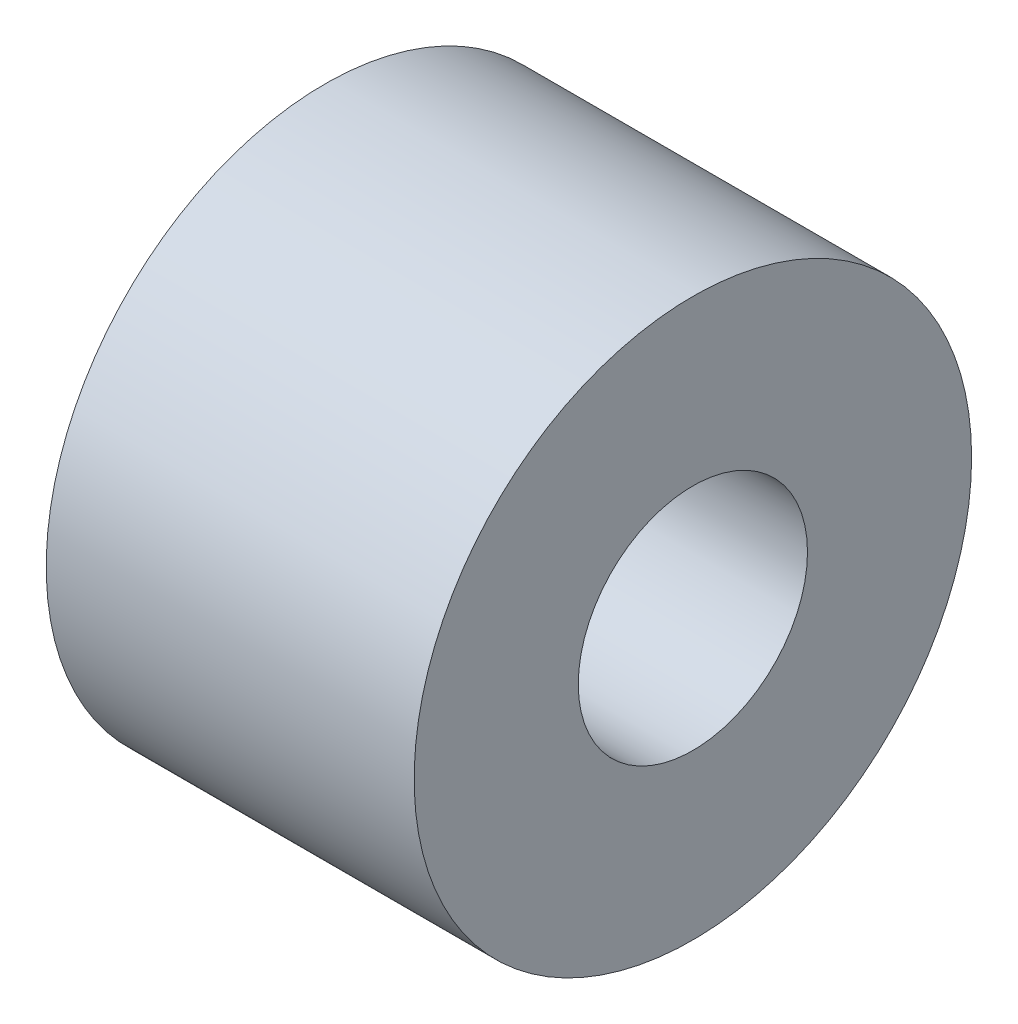
ISO-10303-21;
HEADER;
FILE_DESCRIPTION(('STEP AP214'),'2;1');
FILE_NAME('part.step','',(''),(''),'','','');
FILE_SCHEMA(('AUTOMOTIVE_DESIGN { 1 0 10303 214 1 1 1 1 }'));
ENDSEC;
DATA;
#1=APPLICATION_CONTEXT('core data for automotive mechanical design processes');
#2=APPLICATION_PROTOCOL_DEFINITION('international standard','automotive_design',2000,#1);
#3=PRODUCT_CONTEXT('',#1,'mechanical');
#4=PRODUCT('Part','Part','',(#3));
#5=PRODUCT_RELATED_PRODUCT_CATEGORY('part','',(#4));
#6=PRODUCT_DEFINITION_FORMATION('','',#4);
#7=PRODUCT_DEFINITION_CONTEXT('part definition',#1,'design');
#8=PRODUCT_DEFINITION('design','',#6,#7);
#9=PRODUCT_DEFINITION_SHAPE('','',#8);
#10=(LENGTH_UNIT() NAMED_UNIT(*) SI_UNIT(.MILLI.,.METRE.));
#11=(NAMED_UNIT(*) PLANE_ANGLE_UNIT() SI_UNIT($,.RADIAN.));
#12=(NAMED_UNIT(*) SI_UNIT($,.STERADIAN.) SOLID_ANGLE_UNIT());
#13=UNCERTAINTY_MEASURE_WITH_UNIT(LENGTH_MEASURE(1.E-05),#10,'distance_accuracy_value','');
#14=(GEOMETRIC_REPRESENTATION_CONTEXT(3) GLOBAL_UNCERTAINTY_ASSIGNED_CONTEXT((#13)) GLOBAL_UNIT_ASSIGNED_CONTEXT((#10,
#11,#12)) REPRESENTATION_CONTEXT('',''));
#15=CARTESIAN_POINT('',(0.,0.,0.));
#16=DIRECTION('',(0.,0.,1.));
#17=DIRECTION('',(1.,0.,0.));
#18=AXIS2_PLACEMENT_3D('',#15,#16,#17);
#19=CARTESIAN_POINT('',(0.,0.,0.));
#20=DIRECTION('',(1.,0.,0.));
#21=DIRECTION('',(0.,0.,-1.));
#22=AXIS2_PLACEMENT_3D('',#19,#20,#21);
#23=CYLINDRICAL_SURFACE('',#22,3.2639);
#24=CARTESIAN_POINT('',(10.4775,0.,0.));
#25=DIRECTION('',(1.,0.,0.));
#26=DIRECTION('',(0.,0.,-1.));
#27=AXIS2_PLACEMENT_3D('',#24,#25,#26);
#28=CIRCLE('',#27,3.2639);
#29=CARTESIAN_POINT('',(10.4775,0.,-3.2639));
#30=VERTEX_POINT('',#29);
#31=EDGE_CURVE('E26',#30,#30,#28,.F.);
#32=ORIENTED_EDGE('',*,*,#31,.F.);
#33=EDGE_LOOP('',(#32));
#34=FACE_BOUND('',#33,.T.);
#35=CARTESIAN_POINT('',(0.,0.,0.));
#36=DIRECTION('',(1.,0.,0.));
#37=DIRECTION('',(0.,0.,-1.));
#38=AXIS2_PLACEMENT_3D('',#35,#36,#37);
#39=CIRCLE('',#38,3.2639);
#40=CARTESIAN_POINT('',(0.,0.,-3.2639));
#41=VERTEX_POINT('',#40);
#42=EDGE_CURVE('E17',#41,#41,#39,.F.);
#43=ORIENTED_EDGE('',*,*,#42,.T.);
#44=EDGE_LOOP('',(#43));
#45=FACE_BOUND('',#44,.T.);
#46=ADVANCED_FACE('F14',(#34,#45),#23,.F.);
#47=CARTESIAN_POINT('',(0.,0.,0.));
#48=DIRECTION('',(1.,0.,0.));
#49=DIRECTION('',(0.,0.,-1.));
#50=AXIS2_PLACEMENT_3D('',#47,#48,#49);
#51=PLANE('',#50);
#52=ORIENTED_EDGE('',*,*,#42,.F.);
#53=EDGE_LOOP('',(#52));
#54=FACE_BOUND('',#53,.T.);
#55=CARTESIAN_POINT('',(0.,0.,0.));
#56=DIRECTION('',(1.,0.,0.));
#57=DIRECTION('',(0.,0.,-1.));
#58=AXIS2_PLACEMENT_3D('',#55,#56,#57);
#59=CIRCLE('',#58,7.9375);
#60=CARTESIAN_POINT('',(0.,0.,-7.9375));
#61=VERTEX_POINT('',#60);
#62=EDGE_CURVE('E21',#61,#61,#59,.T.);
#63=ORIENTED_EDGE('',*,*,#62,.F.);
#64=EDGE_LOOP('',(#63));
#65=FACE_BOUND('',#64,.T.);
#66=ADVANCED_FACE('F35',(#54,#65),#51,.F.);
#67=CARTESIAN_POINT('',(10.4775,0.,0.));
#68=DIRECTION('',(1.,0.,0.));
#69=DIRECTION('',(0.,0.,-1.));
#70=AXIS2_PLACEMENT_3D('',#67,#68,#69);
#71=PLANE('',#70);
#72=ORIENTED_EDGE('',*,*,#31,.T.);
#73=EDGE_LOOP('',(#72));
#74=FACE_BOUND('',#73,.T.);
#75=CARTESIAN_POINT('',(10.4775,0.,0.));
#76=DIRECTION('',(1.,0.,0.));
#77=DIRECTION('',(0.,0.,-1.));
#78=AXIS2_PLACEMENT_3D('',#75,#76,#77);
#79=CIRCLE('',#78,7.9375);
#80=CARTESIAN_POINT('',(10.4775,0.,-7.9375));
#81=VERTEX_POINT('',#80);
#82=EDGE_CURVE('E10',#81,#81,#79,.F.);
#83=ORIENTED_EDGE('',*,*,#82,.F.);
#84=EDGE_LOOP('',(#83));
#85=FACE_BOUND('',#84,.T.);
#86=ADVANCED_FACE('F38',(#74,#85),#71,.T.);
#87=CARTESIAN_POINT('',(0.,0.,0.));
#88=DIRECTION('',(1.,0.,0.));
#89=DIRECTION('',(0.,0.,-1.));
#90=AXIS2_PLACEMENT_3D('',#87,#88,#89);
#91=CYLINDRICAL_SURFACE('',#90,7.9375);
#92=ORIENTED_EDGE('',*,*,#82,.T.);
#93=EDGE_LOOP('',(#92));
#94=FACE_BOUND('',#93,.T.);
#95=ORIENTED_EDGE('',*,*,#62,.T.);
#96=EDGE_LOOP('',(#95));
#97=FACE_BOUND('',#96,.T.);
#98=ADVANCED_FACE('F41',(#94,#97),#91,.T.);
#99=CLOSED_SHELL('',(#46,#66,#86,#98));
#100=MANIFOLD_SOLID_BREP('B1',#99);
#101=ADVANCED_BREP_SHAPE_REPRESENTATION('',(#18,#100),#14);
#102=SHAPE_DEFINITION_REPRESENTATION(#9,#101);
ENDSEC;
END-ISO-10303-21;
